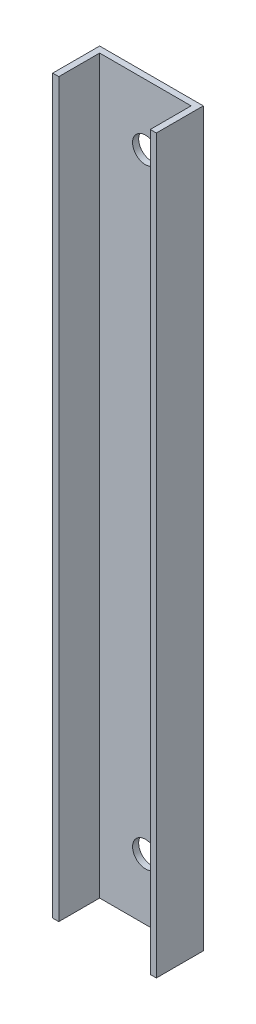
ISO-10303-21;
HEADER;
FILE_DESCRIPTION(('STEP AP214'),'2;1');
FILE_NAME('part.step','',(''),(''),'','','');
FILE_SCHEMA(('AUTOMOTIVE_DESIGN { 1 0 10303 214 1 1 1 1 }'));
ENDSEC;
DATA;
#1=APPLICATION_CONTEXT('core data for automotive mechanical design processes');
#2=APPLICATION_PROTOCOL_DEFINITION('international standard','automotive_design',2000,#1);
#3=PRODUCT_CONTEXT('',#1,'mechanical');
#4=PRODUCT('Part','Part','',(#3));
#5=PRODUCT_RELATED_PRODUCT_CATEGORY('part','',(#4));
#6=PRODUCT_DEFINITION_FORMATION('','',#4);
#7=PRODUCT_DEFINITION_CONTEXT('part definition',#1,'design');
#8=PRODUCT_DEFINITION('design','',#6,#7);
#9=PRODUCT_DEFINITION_SHAPE('','',#8);
#10=(LENGTH_UNIT() NAMED_UNIT(*) SI_UNIT(.MILLI.,.METRE.));
#11=(NAMED_UNIT(*) PLANE_ANGLE_UNIT() SI_UNIT($,.RADIAN.));
#12=(NAMED_UNIT(*) SI_UNIT($,.STERADIAN.) SOLID_ANGLE_UNIT());
#13=UNCERTAINTY_MEASURE_WITH_UNIT(LENGTH_MEASURE(1.E-05),#10,'distance_accuracy_value','');
#14=(GEOMETRIC_REPRESENTATION_CONTEXT(3) GLOBAL_UNCERTAINTY_ASSIGNED_CONTEXT((#13)) GLOBAL_UNIT_ASSIGNED_CONTEXT((#10,
#11,#12)) REPRESENTATION_CONTEXT('',''));
#15=CARTESIAN_POINT('',(0.,0.,0.));
#16=DIRECTION('',(0.,0.,1.));
#17=DIRECTION('',(1.,0.,0.));
#18=AXIS2_PLACEMENT_3D('',#15,#16,#17);
#19=CARTESIAN_POINT('',(5.05454545454545,120.,-7.7));
#20=DIRECTION('',(1.,0.,0.));
#21=DIRECTION('',(0.,0.,-1.));
#22=AXIS2_PLACEMENT_3D('',#19,#20,#21);
#23=PLANE('',#22);
#24=DIRECTION('',(0.,0.,1.));
#25=VECTOR('',#24,1.);
#26=CARTESIAN_POINT('',(5.05454545454545,0.,-7.7));
#27=LINE('',#26,#25);
#28=CARTESIAN_POINT('',(5.05454545454545,0.,-6.7));
#29=VERTEX_POINT('',#28);
#30=CARTESIAN_POINT('',(5.05454545454545,0.,0.));
#31=VERTEX_POINT('',#30);
#32=EDGE_CURVE('E130',#29,#31,#27,.T.);
#33=ORIENTED_EDGE('',*,*,#32,.T.);
#34=DIRECTION('',(0.,-1.,0.));
#35=VECTOR('',#34,1.);
#36=CARTESIAN_POINT('',(5.05454545454545,120.,0.));
#37=LINE('',#36,#35);
#38=CARTESIAN_POINT('',(5.05454545454545,120.,0.));
#39=VERTEX_POINT('',#38);
#40=EDGE_CURVE('E11',#39,#31,#37,.T.);
#41=ORIENTED_EDGE('',*,*,#40,.F.);
#42=DIRECTION('',(0.,0.,1.));
#43=VECTOR('',#42,1.);
#44=CARTESIAN_POINT('',(5.05454545454545,120.,-7.7));
#45=LINE('',#44,#43);
#46=CARTESIAN_POINT('',(5.05454545454545,120.,-6.7));
#47=VERTEX_POINT('',#46);
#48=EDGE_CURVE('E88',#47,#39,#45,.T.);
#49=ORIENTED_EDGE('',*,*,#48,.F.);
#50=DIRECTION('',(0.,-1.,0.));
#51=VECTOR('',#50,1.);
#52=CARTESIAN_POINT('',(5.05454545454545,120.,-6.7));
#53=LINE('',#52,#51);
#54=EDGE_CURVE('E129',#47,#29,#53,.T.);
#55=ORIENTED_EDGE('',*,*,#54,.T.);
#56=EDGE_LOOP('',(#33,#41,#49,#55));
#57=FACE_BOUND('',#56,.T.);
#58=ADVANCED_FACE('F33',(#57),#23,.F.);
#59=CARTESIAN_POINT('',(6.05454545454545,120.,0.));
#60=DIRECTION('',(0.,0.,1.));
#61=DIRECTION('',(1.,0.,0.));
#62=AXIS2_PLACEMENT_3D('',#59,#60,#61);
#63=PLANE('',#62);
#64=DIRECTION('',(-1.,0.,0.));
#65=VECTOR('',#64,1.);
#66=CARTESIAN_POINT('',(6.05454545454545,0.,0.));
#67=LINE('',#66,#65);
#68=CARTESIAN_POINT('',(6.05454545454545,0.,0.));
#69=VERTEX_POINT('',#68);
#70=EDGE_CURVE('E133',#69,#31,#67,.T.);
#71=ORIENTED_EDGE('',*,*,#70,.F.);
#72=DIRECTION('',(0.,-1.,0.));
#73=VECTOR('',#72,1.);
#74=CARTESIAN_POINT('',(6.05454545454545,120.,0.));
#75=LINE('',#74,#73);
#76=CARTESIAN_POINT('',(6.05454545454545,120.,0.));
#77=VERTEX_POINT('',#76);
#78=EDGE_CURVE('E41',#77,#69,#75,.T.);
#79=ORIENTED_EDGE('',*,*,#78,.F.);
#80=DIRECTION('',(-1.,0.,0.));
#81=VECTOR('',#80,1.);
#82=CARTESIAN_POINT('',(6.05454545454545,120.,0.));
#83=LINE('',#82,#81);
#84=EDGE_CURVE('E173',#77,#39,#83,.T.);
#85=ORIENTED_EDGE('',*,*,#84,.T.);
#86=ORIENTED_EDGE('',*,*,#40,.T.);
#87=EDGE_LOOP('',(#71,#79,#85,#86));
#88=FACE_BOUND('',#87,.T.);
#89=ADVANCED_FACE('F164',(#88),#63,.T.);
#90=CARTESIAN_POINT('',(6.05454545454545,120.,-7.7));
#91=DIRECTION('',(1.,0.,0.));
#92=DIRECTION('',(0.,0.,-1.));
#93=AXIS2_PLACEMENT_3D('',#90,#91,#92);
#94=PLANE('',#93);
#95=DIRECTION('',(0.,0.,1.));
#96=VECTOR('',#95,1.);
#97=CARTESIAN_POINT('',(6.05454545454545,0.,-7.7));
#98=LINE('',#97,#96);
#99=CARTESIAN_POINT('',(6.05454545454545,0.,-7.7));
#100=VERTEX_POINT('',#99);
#101=EDGE_CURVE('E137',#100,#69,#98,.T.);
#102=ORIENTED_EDGE('',*,*,#101,.F.);
#103=DIRECTION('',(0.,-1.,0.));
#104=VECTOR('',#103,1.);
#105=CARTESIAN_POINT('',(6.05454545454545,120.,-7.7));
#106=LINE('',#105,#104);
#107=CARTESIAN_POINT('',(6.05454545454545,120.,-7.7));
#108=VERTEX_POINT('',#107);
#109=EDGE_CURVE('E154',#108,#100,#106,.T.);
#110=ORIENTED_EDGE('',*,*,#109,.F.);
#111=DIRECTION('',(0.,0.,1.));
#112=VECTOR('',#111,1.);
#113=CARTESIAN_POINT('',(6.05454545454545,120.,-7.7));
#114=LINE('',#113,#112);
#115=EDGE_CURVE('E161',#108,#77,#114,.T.);
#116=ORIENTED_EDGE('',*,*,#115,.T.);
#117=ORIENTED_EDGE('',*,*,#78,.T.);
#118=EDGE_LOOP('',(#102,#110,#116,#117));
#119=FACE_BOUND('',#118,.T.);
#120=ADVANCED_FACE('F159',(#119),#94,.T.);
#121=CARTESIAN_POINT('',(-10.9454545454545,120.,-7.7));
#122=DIRECTION('',(0.,0.,-1.));
#123=DIRECTION('',(-1.,0.,0.));
#124=AXIS2_PLACEMENT_3D('',#121,#122,#123);
#125=PLANE('',#124);
#126=CARTESIAN_POINT('',(-2.44545454545453,9.99999999999998,-7.7));
#127=DIRECTION('',(0.,0.,-1.));
#128=DIRECTION('',(-1.,0.,0.));
#129=AXIS2_PLACEMENT_3D('',#126,#127,#128);
#130=CIRCLE('',#129,2.1);
#131=CARTESIAN_POINT('',(-4.54545454545454,9.99999999999998,-7.7));
#132=VERTEX_POINT('',#131);
#133=EDGE_CURVE('E183',#132,#132,#130,.T.);
#134=ORIENTED_EDGE('',*,*,#133,.F.);
#135=EDGE_LOOP('',(#134));
#136=FACE_BOUND('',#135,.T.);
#137=CARTESIAN_POINT('',(-2.44545454545455,110.,-7.7));
#138=DIRECTION('',(0.,0.,-1.));
#139=DIRECTION('',(-1.,0.,0.));
#140=AXIS2_PLACEMENT_3D('',#137,#138,#139);
#141=CIRCLE('',#140,2.1);
#142=CARTESIAN_POINT('',(-4.54545454545455,110.,-7.7));
#143=VERTEX_POINT('',#142);
#144=EDGE_CURVE('E134',#143,#143,#141,.T.);
#145=ORIENTED_EDGE('',*,*,#144,.F.);
#146=EDGE_LOOP('',(#145));
#147=FACE_BOUND('',#146,.T.);
#148=DIRECTION('',(1.,0.,0.));
#149=VECTOR('',#148,1.);
#150=CARTESIAN_POINT('',(-10.9454545454545,0.,-7.7));
#151=LINE('',#150,#149);
#152=CARTESIAN_POINT('',(-10.9454545454545,0.,-7.7));
#153=VERTEX_POINT('',#152);
#154=EDGE_CURVE('E140',#153,#100,#151,.T.);
#155=ORIENTED_EDGE('',*,*,#154,.F.);
#156=DIRECTION('',(0.,-1.,0.));
#157=VECTOR('',#156,1.);
#158=CARTESIAN_POINT('',(-10.9454545454545,120.,-7.7));
#159=LINE('',#158,#157);
#160=CARTESIAN_POINT('',(-10.9454545454545,120.,-7.7));
#161=VERTEX_POINT('',#160);
#162=EDGE_CURVE('E152',#161,#153,#159,.T.);
#163=ORIENTED_EDGE('',*,*,#162,.F.);
#164=DIRECTION('',(1.,0.,0.));
#165=VECTOR('',#164,1.);
#166=CARTESIAN_POINT('',(-10.9454545454545,120.,-7.7));
#167=LINE('',#166,#165);
#168=EDGE_CURVE('E124',#161,#108,#167,.T.);
#169=ORIENTED_EDGE('',*,*,#168,.T.);
#170=ORIENTED_EDGE('',*,*,#109,.T.);
#171=EDGE_LOOP('',(#155,#163,#169,#170));
#172=FACE_BOUND('',#171,.T.);
#173=ADVANCED_FACE('F171',(#136,#147,#172),#125,.T.);
#174=CARTESIAN_POINT('',(-10.9454545454545,120.,0.));
#175=DIRECTION('',(-1.,0.,0.));
#176=DIRECTION('',(0.,0.,1.));
#177=AXIS2_PLACEMENT_3D('',#174,#175,#176);
#178=PLANE('',#177);
#179=DIRECTION('',(0.,0.,-1.));
#180=VECTOR('',#179,1.);
#181=CARTESIAN_POINT('',(-10.9454545454545,0.,0.));
#182=LINE('',#181,#180);
#183=CARTESIAN_POINT('',(-10.9454545454545,0.,0.));
#184=VERTEX_POINT('',#183);
#185=EDGE_CURVE('E143',#184,#153,#182,.T.);
#186=ORIENTED_EDGE('',*,*,#185,.F.);
#187=DIRECTION('',(0.,-1.,0.));
#188=VECTOR('',#187,1.);
#189=CARTESIAN_POINT('',(-10.9454545454545,120.,0.));
#190=LINE('',#189,#188);
#191=CARTESIAN_POINT('',(-10.9454545454545,120.,0.));
#192=VERTEX_POINT('',#191);
#193=EDGE_CURVE('E112',#192,#184,#190,.T.);
#194=ORIENTED_EDGE('',*,*,#193,.F.);
#195=DIRECTION('',(0.,0.,-1.));
#196=VECTOR('',#195,1.);
#197=CARTESIAN_POINT('',(-10.9454545454545,120.,0.));
#198=LINE('',#197,#196);
#199=EDGE_CURVE('E122',#192,#161,#198,.T.);
#200=ORIENTED_EDGE('',*,*,#199,.T.);
#201=ORIENTED_EDGE('',*,*,#162,.T.);
#202=EDGE_LOOP('',(#186,#194,#200,#201));
#203=FACE_BOUND('',#202,.T.);
#204=ADVANCED_FACE('F222',(#203),#178,.T.);
#205=CARTESIAN_POINT('',(-9.94545454545455,120.,0.));
#206=DIRECTION('',(0.,0.,1.));
#207=DIRECTION('',(1.,0.,0.));
#208=AXIS2_PLACEMENT_3D('',#205,#206,#207);
#209=PLANE('',#208);
#210=DIRECTION('',(-1.,0.,0.));
#211=VECTOR('',#210,1.);
#212=CARTESIAN_POINT('',(-9.94545454545455,0.,0.));
#213=LINE('',#212,#211);
#214=CARTESIAN_POINT('',(-9.94545454545455,0.,0.));
#215=VERTEX_POINT('',#214);
#216=EDGE_CURVE('E111',#215,#184,#213,.T.);
#217=ORIENTED_EDGE('',*,*,#216,.F.);
#218=DIRECTION('',(0.,-1.,0.));
#219=VECTOR('',#218,1.);
#220=CARTESIAN_POINT('',(-9.94545454545455,120.,0.));
#221=LINE('',#220,#219);
#222=CARTESIAN_POINT('',(-9.94545454545455,120.,0.));
#223=VERTEX_POINT('',#222);
#224=EDGE_CURVE('E105',#223,#215,#221,.T.);
#225=ORIENTED_EDGE('',*,*,#224,.F.);
#226=DIRECTION('',(-1.,0.,0.));
#227=VECTOR('',#226,1.);
#228=CARTESIAN_POINT('',(-9.94545454545455,120.,0.));
#229=LINE('',#228,#227);
#230=EDGE_CURVE('E109',#223,#192,#229,.T.);
#231=ORIENTED_EDGE('',*,*,#230,.T.);
#232=ORIENTED_EDGE('',*,*,#193,.T.);
#233=EDGE_LOOP('',(#217,#225,#231,#232));
#234=FACE_BOUND('',#233,.T.);
#235=ADVANCED_FACE('F107',(#234),#209,.T.);
#236=CARTESIAN_POINT('',(-9.94545454545455,120.,0.));
#237=DIRECTION('',(-1.,0.,0.));
#238=DIRECTION('',(0.,0.,1.));
#239=AXIS2_PLACEMENT_3D('',#236,#237,#238);
#240=PLANE('',#239);
#241=DIRECTION('',(0.,0.,-1.));
#242=VECTOR('',#241,1.);
#243=CARTESIAN_POINT('',(-9.94545454545455,0.,0.));
#244=LINE('',#243,#242);
#245=CARTESIAN_POINT('',(-9.94545454545455,0.,-6.7));
#246=VERTEX_POINT('',#245);
#247=EDGE_CURVE('E76',#215,#246,#244,.T.);
#248=ORIENTED_EDGE('',*,*,#247,.T.);
#249=DIRECTION('',(0.,-1.,0.));
#250=VECTOR('',#249,1.);
#251=CARTESIAN_POINT('',(-9.94545454545455,120.,-6.7));
#252=LINE('',#251,#250);
#253=CARTESIAN_POINT('',(-9.94545454545455,120.,-6.7));
#254=VERTEX_POINT('',#253);
#255=EDGE_CURVE('E113',#254,#246,#252,.T.);
#256=ORIENTED_EDGE('',*,*,#255,.F.);
#257=DIRECTION('',(0.,0.,-1.));
#258=VECTOR('',#257,1.);
#259=CARTESIAN_POINT('',(-9.94545454545455,120.,0.));
#260=LINE('',#259,#258);
#261=EDGE_CURVE('E115',#223,#254,#260,.T.);
#262=ORIENTED_EDGE('',*,*,#261,.F.);
#263=ORIENTED_EDGE('',*,*,#224,.T.);
#264=EDGE_LOOP('',(#248,#256,#262,#263));
#265=FACE_BOUND('',#264,.T.);
#266=ADVANCED_FACE('F116',(#265),#240,.F.);
#267=CARTESIAN_POINT('',(-10.9454545454545,120.,-6.7));
#268=DIRECTION('',(0.,0.,-1.));
#269=DIRECTION('',(-1.,0.,0.));
#270=AXIS2_PLACEMENT_3D('',#267,#268,#269);
#271=PLANE('',#270);
#272=CARTESIAN_POINT('',(-2.44545454545453,9.99999999999998,-6.7));
#273=DIRECTION('',(0.,0.,1.));
#274=DIRECTION('',(-1.,0.,0.));
#275=AXIS2_PLACEMENT_3D('',#272,#273,#274);
#276=CIRCLE('',#275,2.1);
#277=CARTESIAN_POINT('',(-4.54545454545454,9.99999999999998,-6.7));
#278=VERTEX_POINT('',#277);
#279=EDGE_CURVE('E186',#278,#278,#276,.T.);
#280=ORIENTED_EDGE('',*,*,#279,.F.);
#281=EDGE_LOOP('',(#280));
#282=FACE_BOUND('',#281,.T.);
#283=CARTESIAN_POINT('',(-2.44545454545455,110.,-6.7));
#284=DIRECTION('',(0.,0.,1.));
#285=DIRECTION('',(1.,0.,0.));
#286=AXIS2_PLACEMENT_3D('',#283,#284,#285);
#287=CIRCLE('',#286,2.1);
#288=CARTESIAN_POINT('',(-0.345454545454546,110.,-6.7));
#289=VERTEX_POINT('',#288);
#290=EDGE_CURVE('E180',#289,#289,#287,.T.);
#291=ORIENTED_EDGE('',*,*,#290,.F.);
#292=EDGE_LOOP('',(#291));
#293=FACE_BOUND('',#292,.T.);
#294=DIRECTION('',(1.,0.,0.));
#295=VECTOR('',#294,1.);
#296=CARTESIAN_POINT('',(-10.9454545454545,0.,-6.7));
#297=LINE('',#296,#295);
#298=EDGE_CURVE('E82',#246,#29,#297,.T.);
#299=ORIENTED_EDGE('',*,*,#298,.T.);
#300=ORIENTED_EDGE('',*,*,#54,.F.);
#301=DIRECTION('',(1.,0.,0.));
#302=VECTOR('',#301,1.);
#303=CARTESIAN_POINT('',(-10.9454545454545,120.,-6.7));
#304=LINE('',#303,#302);
#305=EDGE_CURVE('E49',#254,#47,#304,.T.);
#306=ORIENTED_EDGE('',*,*,#305,.F.);
#307=ORIENTED_EDGE('',*,*,#255,.T.);
#308=EDGE_LOOP('',(#299,#300,#306,#307));
#309=FACE_BOUND('',#308,.T.);
#310=ADVANCED_FACE('F192',(#282,#293,#309),#271,.F.);
#311=CARTESIAN_POINT('',(0.,120.,0.));
#312=DIRECTION('',(0.,-1.,0.));
#313=DIRECTION('',(-1.,0.,0.));
#314=AXIS2_PLACEMENT_3D('',#311,#312,#313);
#315=PLANE('',#314);
#316=ORIENTED_EDGE('',*,*,#48,.T.);
#317=ORIENTED_EDGE('',*,*,#84,.F.);
#318=ORIENTED_EDGE('',*,*,#115,.F.);
#319=ORIENTED_EDGE('',*,*,#168,.F.);
#320=ORIENTED_EDGE('',*,*,#199,.F.);
#321=ORIENTED_EDGE('',*,*,#230,.F.);
#322=ORIENTED_EDGE('',*,*,#261,.T.);
#323=ORIENTED_EDGE('',*,*,#305,.T.);
#324=EDGE_LOOP('',(#316,#317,#318,#319,#320,#321,#322,#323));
#325=FACE_BOUND('',#324,.T.);
#326=ADVANCED_FACE('F119',(#325),#315,.F.);
#327=CARTESIAN_POINT('',(0.,0.,0.));
#328=DIRECTION('',(0.,-1.,0.));
#329=DIRECTION('',(-1.,0.,0.));
#330=AXIS2_PLACEMENT_3D('',#327,#328,#329);
#331=PLANE('',#330);
#332=ORIENTED_EDGE('',*,*,#32,.F.);
#333=ORIENTED_EDGE('',*,*,#298,.F.);
#334=ORIENTED_EDGE('',*,*,#247,.F.);
#335=ORIENTED_EDGE('',*,*,#216,.T.);
#336=ORIENTED_EDGE('',*,*,#185,.T.);
#337=ORIENTED_EDGE('',*,*,#154,.T.);
#338=ORIENTED_EDGE('',*,*,#101,.T.);
#339=ORIENTED_EDGE('',*,*,#70,.T.);
#340=EDGE_LOOP('',(#332,#333,#334,#335,#336,#337,#338,#339));
#341=FACE_BOUND('',#340,.T.);
#342=ADVANCED_FACE('F167',(#341),#331,.T.);
#343=CARTESIAN_POINT('',(-2.44545454545455,110.,-16.7));
#344=DIRECTION('',(0.,0.,1.));
#345=DIRECTION('',(1.,0.,0.));
#346=AXIS2_PLACEMENT_3D('',#343,#344,#345);
#347=CYLINDRICAL_SURFACE('',#346,2.1);
#348=ORIENTED_EDGE('',*,*,#144,.T.);
#349=EDGE_LOOP('',(#348));
#350=FACE_BOUND('',#349,.T.);
#351=ORIENTED_EDGE('',*,*,#290,.T.);
#352=EDGE_LOOP('',(#351));
#353=FACE_BOUND('',#352,.T.);
#354=ADVANCED_FACE('F198',(#350,#353),#347,.F.);
#355=CARTESIAN_POINT('',(-2.44545454545453,9.99999999999998,-16.7));
#356=DIRECTION('',(0.,0.,1.));
#357=DIRECTION('',(1.,0.,0.));
#358=AXIS2_PLACEMENT_3D('',#355,#356,#357);
#359=CYLINDRICAL_SURFACE('',#358,2.1);
#360=ORIENTED_EDGE('',*,*,#133,.T.);
#361=EDGE_LOOP('',(#360));
#362=FACE_BOUND('',#361,.T.);
#363=ORIENTED_EDGE('',*,*,#279,.T.);
#364=EDGE_LOOP('',(#363));
#365=FACE_BOUND('',#364,.T.);
#366=ADVANCED_FACE('F190',(#362,#365),#359,.F.);
#367=CLOSED_SHELL('',(#58,#89,#120,#173,#204,#235,#266,#310,#326,#342,#354,#366));
#368=MANIFOLD_SOLID_BREP('B2',#367);
#369=ADVANCED_BREP_SHAPE_REPRESENTATION('',(#18,#368),#14);
#370=SHAPE_DEFINITION_REPRESENTATION(#9,#369);
ENDSEC;
END-ISO-10303-21;
